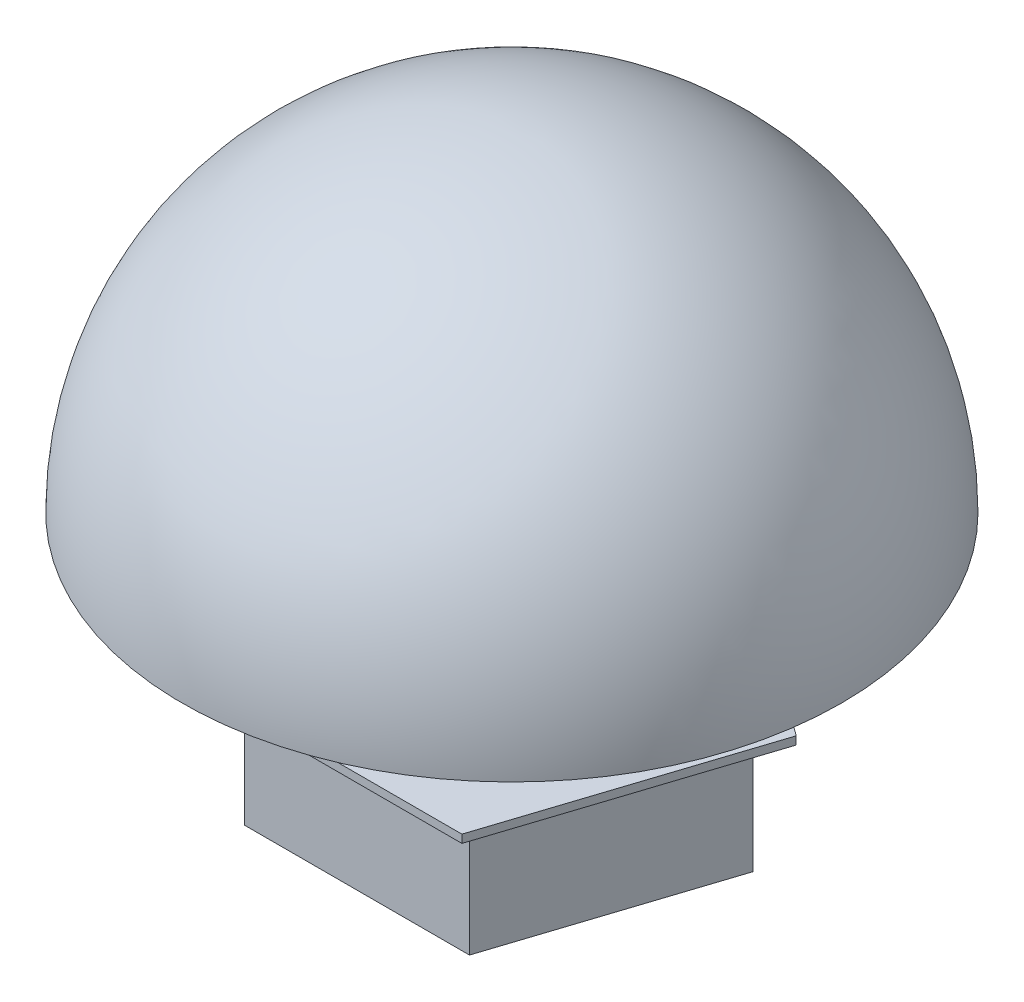
ISO-10303-21;
HEADER;
FILE_DESCRIPTION(('STEP AP214'),'2;1');
FILE_NAME('part.step','',(''),(''),'','','');
FILE_SCHEMA(('AUTOMOTIVE_DESIGN { 1 0 10303 214 1 1 1 1 }'));
ENDSEC;
DATA;
#1=APPLICATION_CONTEXT('core data for automotive mechanical design processes');
#2=APPLICATION_PROTOCOL_DEFINITION('international standard','automotive_design',2000,#1);
#3=PRODUCT_CONTEXT('',#1,'mechanical');
#4=PRODUCT('Part','Part','',(#3));
#5=PRODUCT_RELATED_PRODUCT_CATEGORY('part','',(#4));
#6=PRODUCT_DEFINITION_FORMATION('','',#4);
#7=PRODUCT_DEFINITION_CONTEXT('part definition',#1,'design');
#8=PRODUCT_DEFINITION('design','',#6,#7);
#9=PRODUCT_DEFINITION_SHAPE('','',#8);
#10=(LENGTH_UNIT() NAMED_UNIT(*) SI_UNIT(.MILLI.,.METRE.));
#11=(NAMED_UNIT(*) PLANE_ANGLE_UNIT() SI_UNIT($,.RADIAN.));
#12=(NAMED_UNIT(*) SI_UNIT($,.STERADIAN.) SOLID_ANGLE_UNIT());
#13=UNCERTAINTY_MEASURE_WITH_UNIT(LENGTH_MEASURE(1.E-05),#10,'distance_accuracy_value','');
#14=(GEOMETRIC_REPRESENTATION_CONTEXT(3) GLOBAL_UNCERTAINTY_ASSIGNED_CONTEXT((#13)) GLOBAL_UNIT_ASSIGNED_CONTEXT((#10,
#11,#12)) REPRESENTATION_CONTEXT('',''));
#15=CARTESIAN_POINT('',(0.,0.,0.));
#16=DIRECTION('',(0.,0.,1.));
#17=DIRECTION('',(1.,0.,0.));
#18=AXIS2_PLACEMENT_3D('',#15,#16,#17);
#19=CARTESIAN_POINT('',(0.,31.,0.));
#20=DIRECTION('',(0.,-1.,0.));
#21=DIRECTION('',(1.,0.,0.));
#22=AXIS2_PLACEMENT_3D('',#19,#20,#21);
#23=SPHERICAL_SURFACE('',#22,41.);
#24=CARTESIAN_POINT('',(0.,31.,0.));
#25=DIRECTION('',(0.,-1.,0.));
#26=DIRECTION('',(0.,0.,-1.));
#27=AXIS2_PLACEMENT_3D('',#24,#25,#26);
#28=CIRCLE('',#27,41.);
#29=CARTESIAN_POINT('',(0.,31.,-41.));
#30=VERTEX_POINT('',#29);
#31=EDGE_CURVE('E49',#30,#30,#28,.T.);
#32=ORIENTED_EDGE('',*,*,#31,.F.);
#33=EDGE_LOOP('',(#32));
#34=FACE_BOUND('',#33,.T.);
#35=ADVANCED_FACE('F43',(#34),#23,.T.);
#36=CARTESIAN_POINT('',(0.,31.,0.));
#37=DIRECTION('',(0.,-1.,0.));
#38=DIRECTION('',(-1.,0.,0.));
#39=AXIS2_PLACEMENT_3D('',#36,#37,#38);
#40=SPHERICAL_SURFACE('',#39,40.);
#41=CARTESIAN_POINT('',(0.,31.,0.));
#42=DIRECTION('',(0.,-1.,0.));
#43=DIRECTION('',(0.,0.,-1.));
#44=AXIS2_PLACEMENT_3D('',#41,#42,#43);
#45=CIRCLE('',#44,40.);
#46=CARTESIAN_POINT('',(0.,31.,-40.));
#47=VERTEX_POINT('',#46);
#48=EDGE_CURVE('E11',#47,#47,#45,.T.);
#49=ORIENTED_EDGE('',*,*,#48,.T.);
#50=EDGE_LOOP('',(#49));
#51=FACE_BOUND('',#50,.T.);
#52=ADVANCED_FACE('F58',(#51),#40,.F.);
#53=CARTESIAN_POINT('',(-40.,31.,0.));
#54=DIRECTION('',(0.,1.,0.));
#55=DIRECTION('',(0.,0.,1.));
#56=AXIS2_PLACEMENT_3D('',#53,#54,#55);
#57=PLANE('',#56);
#58=ORIENTED_EDGE('',*,*,#48,.F.);
#59=EDGE_LOOP('',(#58));
#60=FACE_BOUND('',#59,.T.);
#61=ORIENTED_EDGE('',*,*,#31,.T.);
#62=EDGE_LOOP('',(#61));
#63=FACE_BOUND('',#62,.T.);
#64=ADVANCED_FACE('F55',(#60,#63),#57,.F.);
#65=CLOSED_SHELL('',(#35,#52,#64));
#66=MANIFOLD_SOLID_BREP('B2',#65);
#67=CARTESIAN_POINT('',(0.,16.,0.));
#68=DIRECTION('',(0.,1.,0.));
#69=DIRECTION('',(0.,0.,1.));
#70=AXIS2_PLACEMENT_3D('',#67,#68,#69);
#71=PLANE('',#70);
#72=CARTESIAN_POINT('',(0.,16.,0.));
#73=DIRECTION('',(0.,1.,0.));
#74=DIRECTION('',(0.,0.,1.));
#75=AXIS2_PLACEMENT_3D('',#72,#73,#74);
#76=CIRCLE('',#75,2.5);
#77=CARTESIAN_POINT('',(0.,16.,2.5));
#78=VERTEX_POINT('',#77);
#79=EDGE_CURVE('E363',#78,#78,#76,.T.);
#80=ORIENTED_EDGE('',*,*,#79,.F.);
#81=EDGE_LOOP('',(#80));
#82=FACE_BOUND('',#81,.T.);
#83=DIRECTION('',(1.,0.,0.));
#84=VECTOR('',#83,1.);
#85=CARTESIAN_POINT('',(-16.5,16.,22.7103016877744));
#86=LINE('',#85,#84);
#87=CARTESIAN_POINT('',(-16.5,16.,22.7103016877744));
#88=VERTEX_POINT('',#87);
#89=CARTESIAN_POINT('',(16.5,16.,22.7103016877744));
#90=VERTEX_POINT('',#89);
#91=EDGE_CURVE('E370',#88,#90,#86,.T.);
#92=ORIENTED_EDGE('',*,*,#91,.T.);
#93=DIRECTION('',(0.309016994374947,0.,-0.951056516295153));
#94=VECTOR('',#93,1.);
#95=CARTESIAN_POINT('',(16.5,16.,22.7103016877744));
#96=LINE('',#95,#94);
#97=CARTESIAN_POINT('',(26.6975608143733,16.,-8.67456334996571));
#98=VERTEX_POINT('',#97);
#99=EDGE_CURVE('E373',#90,#98,#96,.T.);
#100=ORIENTED_EDGE('',*,*,#99,.T.);
#101=DIRECTION('',(-0.809016994374947,0.,-0.587785252292473));
#102=VECTOR('',#101,1.);
#103=CARTESIAN_POINT('',(26.6975608143733,16.,-8.67456334996571));
#104=LINE('',#103,#102);
#105=CARTESIAN_POINT('',(0.,16.,-28.0714766756173));
#106=VERTEX_POINT('',#105);
#107=EDGE_CURVE('E376',#98,#106,#104,.T.);
#108=ORIENTED_EDGE('',*,*,#107,.T.);
#109=DIRECTION('',(-0.809016994374947,0.,0.587785252292473));
#110=VECTOR('',#109,1.);
#111=CARTESIAN_POINT('',(0.,16.,-28.0714766756173));
#112=LINE('',#111,#110);
#113=CARTESIAN_POINT('',(-26.6975608143733,16.,-8.6745633499657));
#114=VERTEX_POINT('',#113);
#115=EDGE_CURVE('E378',#106,#114,#112,.T.);
#116=ORIENTED_EDGE('',*,*,#115,.T.);
#117=DIRECTION('',(0.309016994374947,0.,0.951056516295153));
#118=VECTOR('',#117,1.);
#119=CARTESIAN_POINT('',(-26.6975608143733,16.,-8.6745633499657));
#120=LINE('',#119,#118);
#121=EDGE_CURVE('E380',#114,#88,#120,.T.);
#122=ORIENTED_EDGE('',*,*,#121,.T.);
#123=EDGE_LOOP('',(#92,#100,#108,#116,#122));
#124=FACE_BOUND('',#123,.T.);
#125=DIRECTION('',(1.,0.,0.));
#126=VECTOR('',#125,1.);
#127=CARTESIAN_POINT('',(-0.499999999999999,16.,-8.));
#128=LINE('',#127,#126);
#129=CARTESIAN_POINT('',(-0.499999999999999,16.,-8.));
#130=VERTEX_POINT('',#129);
#131=CARTESIAN_POINT('',(0.499999999999999,16.,-8.));
#132=VERTEX_POINT('',#131);
#133=EDGE_CURVE('E346',#130,#132,#128,.T.);
#134=ORIENTED_EDGE('',*,*,#133,.F.);
#135=DIRECTION('',(0.,0.,1.));
#136=VECTOR('',#135,1.);
#137=CARTESIAN_POINT('',(-0.5,16.,-19.7162013210007));
#138=LINE('',#137,#136);
#139=CARTESIAN_POINT('',(-0.5,16.,-19.7162013210007));
#140=VERTEX_POINT('',#139);
#141=EDGE_CURVE('E343',#140,#130,#138,.T.);
#142=ORIENTED_EDGE('',*,*,#141,.F.);
#143=DIRECTION('',(-1.,0.,0.));
#144=VECTOR('',#143,1.);
#145=CARTESIAN_POINT('',(-0.5,16.,-19.7162013210007));
#146=LINE('',#145,#144);
#147=CARTESIAN_POINT('',(0.5,16.,-19.7162013210007));
#148=VERTEX_POINT('',#147);
#149=EDGE_CURVE('E351',#148,#140,#146,.T.);
#150=ORIENTED_EDGE('',*,*,#149,.F.);
#151=DIRECTION('',(0.,0.,-1.));
#152=VECTOR('',#151,1.);
#153=CARTESIAN_POINT('',(0.5,16.,-19.7162013210007));
#154=LINE('',#153,#152);
#155=EDGE_CURVE('E348',#132,#148,#154,.T.);
#156=ORIENTED_EDGE('',*,*,#155,.F.);
#157=EDGE_LOOP('',(#134,#142,#150,#156));
#158=FACE_BOUND('',#157,.T.);
#159=DIRECTION('',(-0.866025403784439,0.,-0.5));
#160=VECTOR('',#159,1.);
#161=CARTESIAN_POINT('',(17.3247312101156,16.,9.4250879586077));
#162=LINE('',#161,#160);
#163=CARTESIAN_POINT('',(17.3247312101156,16.,9.4250879586077));
#164=VERTEX_POINT('',#163);
#165=CARTESIAN_POINT('',(7.17820323027617,16.,3.56698729810734));
#166=VERTEX_POINT('',#165);
#167=EDGE_CURVE('E328',#164,#166,#162,.T.);
#168=ORIENTED_EDGE('',*,*,#167,.F.);
#169=DIRECTION('',(0.5,0.,-0.866025403784439));
#170=VECTOR('',#169,1.);
#171=CARTESIAN_POINT('',(17.3247312101156,16.,9.4250879586077));
#172=LINE('',#171,#170);
#173=CARTESIAN_POINT('',(16.8247312101156,16.,10.2911133623921));
#174=VERTEX_POINT('',#173);
#175=EDGE_CURVE('E273',#174,#164,#172,.T.);
#176=ORIENTED_EDGE('',*,*,#175,.F.);
#177=DIRECTION('',(0.866025403784439,0.,0.5));
#178=VECTOR('',#177,1.);
#179=CARTESIAN_POINT('',(16.8247312101156,16.,10.2911133623921));
#180=LINE('',#179,#178);
#181=CARTESIAN_POINT('',(6.67820323027617,16.,4.43301270189178));
#182=VERTEX_POINT('',#181);
#183=EDGE_CURVE('E332',#182,#174,#180,.T.);
#184=ORIENTED_EDGE('',*,*,#183,.F.);
#185=DIRECTION('',(-0.5,0.,0.866025403784438));
#186=VECTOR('',#185,1.);
#187=CARTESIAN_POINT('',(7.17820323027617,16.,3.56698729810734));
#188=LINE('',#187,#186);
#189=EDGE_CURVE('E330',#166,#182,#188,.T.);
#190=ORIENTED_EDGE('',*,*,#189,.F.);
#191=EDGE_LOOP('',(#168,#176,#184,#190));
#192=FACE_BOUND('',#191,.T.);
#193=DIRECTION('',(0.866025403784438,0.,-0.5));
#194=VECTOR('',#193,1.);
#195=CARTESIAN_POINT('',(-16.8247312101142,16.,10.2911133623929));
#196=LINE('',#195,#194);
#197=CARTESIAN_POINT('',(-16.8247312101142,16.,10.2911133623929));
#198=VERTEX_POINT('',#197);
#199=CARTESIAN_POINT('',(-6.6782032302748,16.,4.43301270189257));
#200=VERTEX_POINT('',#199);
#201=EDGE_CURVE('E316',#198,#200,#196,.T.);
#202=ORIENTED_EDGE('',*,*,#201,.F.);
#203=DIRECTION('',(0.5,0.,0.866025403784439));
#204=VECTOR('',#203,1.);
#205=CARTESIAN_POINT('',(-16.8247312101142,16.,10.2911133623929));
#206=LINE('',#205,#204);
#207=CARTESIAN_POINT('',(-17.3247312101142,16.,9.4250879586085));
#208=VERTEX_POINT('',#207);
#209=EDGE_CURVE('E270',#208,#198,#206,.T.);
#210=ORIENTED_EDGE('',*,*,#209,.F.);
#211=DIRECTION('',(-0.866025403784438,0.,0.5));
#212=VECTOR('',#211,1.);
#213=CARTESIAN_POINT('',(-17.3247312101142,16.,9.4250879586085));
#214=LINE('',#213,#212);
#215=CARTESIAN_POINT('',(-7.1782032302748,16.,3.56698729810814));
#216=VERTEX_POINT('',#215);
#217=EDGE_CURVE('E320',#216,#208,#214,.T.);
#218=ORIENTED_EDGE('',*,*,#217,.F.);
#219=DIRECTION('',(-0.500000000000001,0.,-0.866025403784438));
#220=VECTOR('',#219,1.);
#221=CARTESIAN_POINT('',(-6.6782032302748,16.,4.43301270189257));
#222=LINE('',#221,#220);
#223=EDGE_CURVE('E318',#200,#216,#222,.T.);
#224=ORIENTED_EDGE('',*,*,#223,.F.);
#225=EDGE_LOOP('',(#202,#210,#218,#224));
#226=FACE_BOUND('',#225,.T.);
#227=ADVANCED_FACE('F84',(#82,#124,#158,#192,#226),#71,.T.);
#228=CARTESIAN_POINT('',(0.,0.,0.));
#229=DIRECTION('',(0.,1.,0.));
#230=DIRECTION('',(0.,0.,1.));
#231=AXIS2_PLACEMENT_3D('',#228,#229,#230);
#232=PLANE('',#231);
#233=DIRECTION('',(-0.809016994374947,0.,0.587785252292473));
#234=VECTOR('',#233,1.);
#235=CARTESIAN_POINT('',(0.,0.,-23.8182226338571));
#236=LINE('',#235,#234);
#237=CARTESIAN_POINT('',(0.,0.,-23.8182226338571));
#238=VERTEX_POINT('',#237);
#239=CARTESIAN_POINT('',(-22.6524758424985,0.,-7.36023556966787));
#240=VERTEX_POINT('',#239);
#241=EDGE_CURVE('E448',#238,#240,#236,.T.);
#242=ORIENTED_EDGE('',*,*,#241,.F.);
#243=DIRECTION('',(-0.809016994374948,0.,-0.587785252292473));
#244=VECTOR('',#243,1.);
#245=CARTESIAN_POINT('',(22.6524758424985,0.,-7.36023556966788));
#246=LINE('',#245,#244);
#247=CARTESIAN_POINT('',(22.6524758424985,0.,-7.36023556966788));
#248=VERTEX_POINT('',#247);
#249=EDGE_CURVE('E453',#248,#238,#246,.T.);
#250=ORIENTED_EDGE('',*,*,#249,.F.);
#251=DIRECTION('',(0.309016994374947,0.,-0.951056516295154));
#252=VECTOR('',#251,1.);
#253=CARTESIAN_POINT('',(14.,0.,19.2693468865964));
#254=LINE('',#253,#252);
#255=CARTESIAN_POINT('',(14.,0.,19.2693468865964));
#256=VERTEX_POINT('',#255);
#257=EDGE_CURVE('E472',#256,#248,#254,.T.);
#258=ORIENTED_EDGE('',*,*,#257,.F.);
#259=DIRECTION('',(1.,0.,0.));
#260=VECTOR('',#259,1.);
#261=CARTESIAN_POINT('',(-14.,0.,19.2693468865964));
#262=LINE('',#261,#260);
#263=CARTESIAN_POINT('',(-14.,0.,19.2693468865964));
#264=VERTEX_POINT('',#263);
#265=EDGE_CURVE('E470',#264,#256,#262,.T.);
#266=ORIENTED_EDGE('',*,*,#265,.F.);
#267=DIRECTION('',(0.309016994374947,0.,0.951056516295154));
#268=VECTOR('',#267,1.);
#269=CARTESIAN_POINT('',(-22.6524758424985,0.,-7.36023556966787));
#270=LINE('',#269,#268);
#271=EDGE_CURVE('E468',#240,#264,#270,.T.);
#272=ORIENTED_EDGE('',*,*,#271,.F.);
#273=EDGE_LOOP('',(#242,#250,#258,#266,#272));
#274=FACE_BOUND('',#273,.T.);
#275=DIRECTION('',(1.,0.,0.));
#276=VECTOR('',#275,1.);
#277=CARTESIAN_POINT('',(-13.2734574719946,0.,18.2693468865964));
#278=LINE('',#277,#276);
#279=CARTESIAN_POINT('',(-13.2734574719946,0.,18.2693468865964));
#280=VERTEX_POINT('',#279);
#281=CARTESIAN_POINT('',(13.2734574719946,0.,18.2693468865964));
#282=VERTEX_POINT('',#281);
#283=EDGE_CURVE('E406',#280,#282,#278,.T.);
#284=ORIENTED_EDGE('',*,*,#283,.T.);
#285=DIRECTION('',(0.309016994374948,0.,-0.951056516295154));
#286=VECTOR('',#285,1.);
#287=CARTESIAN_POINT('',(13.2734574719946,0.,18.2693468865964));
#288=LINE('',#287,#286);
#289=CARTESIAN_POINT('',(21.4769053379136,0.,-6.97826955841777));
#290=VERTEX_POINT('',#289);
#291=EDGE_CURVE('E426',#282,#290,#288,.T.);
#292=ORIENTED_EDGE('',*,*,#291,.T.);
#293=DIRECTION('',(-0.809016994374947,0.,-0.587785252292473));
#294=VECTOR('',#293,1.);
#295=CARTESIAN_POINT('',(21.4769053379136,0.,-6.97826955841777));
#296=LINE('',#295,#294);
#297=CARTESIAN_POINT('',(0.,0.,-22.5821546563573));
#298=VERTEX_POINT('',#297);
#299=EDGE_CURVE('E429',#290,#298,#296,.T.);
#300=ORIENTED_EDGE('',*,*,#299,.T.);
#301=DIRECTION('',(-0.809016994374947,0.,0.587785252292473));
#302=VECTOR('',#301,1.);
#303=CARTESIAN_POINT('',(0.,0.,-22.5821546563573));
#304=LINE('',#303,#302);
#305=CARTESIAN_POINT('',(-21.4769053379136,0.,-6.97826955841777));
#306=VERTEX_POINT('',#305);
#307=EDGE_CURVE('E432',#298,#306,#304,.T.);
#308=ORIENTED_EDGE('',*,*,#307,.T.);
#309=DIRECTION('',(0.309016994374948,0.,0.951056516295154));
#310=VECTOR('',#309,1.);
#311=CARTESIAN_POINT('',(-21.4769053379136,0.,-6.97826955841777));
#312=LINE('',#311,#310);
#313=EDGE_CURVE('E411',#306,#280,#312,.T.);
#314=ORIENTED_EDGE('',*,*,#313,.T.);
#315=EDGE_LOOP('',(#284,#292,#300,#308,#314));
#316=FACE_BOUND('',#315,.T.);
#317=ADVANCED_FACE('F491',(#274,#316),#232,.F.);
#318=CARTESIAN_POINT('',(0.,15.,-23.8182226338571));
#319=DIRECTION('',(0.587785252292473,0.,0.809016994374947));
#320=DIRECTION('',(0.809016994374948,0.,-0.587785252292473));
#321=AXIS2_PLACEMENT_3D('',#318,#319,#320);
#322=PLANE('',#321);
#323=ORIENTED_EDGE('',*,*,#241,.T.);
#324=DIRECTION('',(0.,-1.,0.));
#325=VECTOR('',#324,1.);
#326=CARTESIAN_POINT('',(-22.6524758424985,15.,-7.36023556966787));
#327=LINE('',#326,#325);
#328=CARTESIAN_POINT('',(-22.6524758424985,15.,-7.36023556966787));
#329=VERTEX_POINT('',#328);
#330=EDGE_CURVE('E41',#329,#240,#327,.T.);
#331=ORIENTED_EDGE('',*,*,#330,.F.);
#332=DIRECTION('',(-0.809016994374947,0.,0.587785252292473));
#333=VECTOR('',#332,1.);
#334=CARTESIAN_POINT('',(0.,15.,-23.8182226338571));
#335=LINE('',#334,#333);
#336=CARTESIAN_POINT('',(0.,15.,-23.8182226338571));
#337=VERTEX_POINT('',#336);
#338=EDGE_CURVE('E449',#337,#329,#335,.T.);
#339=ORIENTED_EDGE('',*,*,#338,.F.);
#340=DIRECTION('',(0.,-1.,0.));
#341=VECTOR('',#340,1.);
#342=CARTESIAN_POINT('',(0.,15.,-23.8182226338571));
#343=LINE('',#342,#341);
#344=EDGE_CURVE('E465',#337,#238,#343,.T.);
#345=ORIENTED_EDGE('',*,*,#344,.T.);
#346=EDGE_LOOP('',(#323,#331,#339,#345));
#347=FACE_BOUND('',#346,.T.);
#348=ADVANCED_FACE('F86',(#347),#322,.F.);
#349=CARTESIAN_POINT('',(-22.6524758424985,15.,-7.36023556966787));
#350=DIRECTION('',(0.951056516295154,0.,-0.309016994374947));
#351=DIRECTION('',(-0.309016994374947,0.,-0.951056516295154));
#352=AXIS2_PLACEMENT_3D('',#349,#350,#351);
#353=PLANE('',#352);
#354=ORIENTED_EDGE('',*,*,#271,.T.);
#355=DIRECTION('',(0.,-1.,0.));
#356=VECTOR('',#355,1.);
#357=CARTESIAN_POINT('',(-14.,15.,19.2693468865964));
#358=LINE('',#357,#356);
#359=CARTESIAN_POINT('',(-14.,15.,19.2693468865964));
#360=VERTEX_POINT('',#359);
#361=EDGE_CURVE('E92',#360,#264,#358,.T.);
#362=ORIENTED_EDGE('',*,*,#361,.F.);
#363=DIRECTION('',(0.309016994374947,0.,0.951056516295154));
#364=VECTOR('',#363,1.);
#365=CARTESIAN_POINT('',(-22.6524758424985,15.,-7.36023556966787));
#366=LINE('',#365,#364);
#367=EDGE_CURVE('E452',#329,#360,#366,.T.);
#368=ORIENTED_EDGE('',*,*,#367,.F.);
#369=ORIENTED_EDGE('',*,*,#330,.T.);
#370=EDGE_LOOP('',(#354,#362,#368,#369));
#371=FACE_BOUND('',#370,.T.);
#372=ADVANCED_FACE('F504',(#371),#353,.F.);
#373=CARTESIAN_POINT('',(-14.,15.,19.2693468865964));
#374=DIRECTION('',(0.,0.,-1.));
#375=DIRECTION('',(-1.,0.,0.));
#376=AXIS2_PLACEMENT_3D('',#373,#374,#375);
#377=PLANE('',#376);
#378=ORIENTED_EDGE('',*,*,#265,.T.);
#379=DIRECTION('',(0.,-1.,0.));
#380=VECTOR('',#379,1.);
#381=CARTESIAN_POINT('',(14.,15.,19.2693468865964));
#382=LINE('',#381,#380);
#383=CARTESIAN_POINT('',(14.,15.,19.2693468865964));
#384=VERTEX_POINT('',#383);
#385=EDGE_CURVE('E480',#384,#256,#382,.T.);
#386=ORIENTED_EDGE('',*,*,#385,.F.);
#387=DIRECTION('',(1.,0.,0.));
#388=VECTOR('',#387,1.);
#389=CARTESIAN_POINT('',(-14.,15.,19.2693468865964));
#390=LINE('',#389,#388);
#391=EDGE_CURVE('E456',#360,#384,#390,.T.);
#392=ORIENTED_EDGE('',*,*,#391,.F.);
#393=ORIENTED_EDGE('',*,*,#361,.T.);
#394=EDGE_LOOP('',(#378,#386,#392,#393));
#395=FACE_BOUND('',#394,.T.);
#396=ADVANCED_FACE('F486',(#395),#377,.F.);
#397=CARTESIAN_POINT('',(14.,15.,19.2693468865964));
#398=DIRECTION('',(-0.951056516295154,0.,-0.309016994374947));
#399=DIRECTION('',(-0.309016994374947,0.,0.951056516295154));
#400=AXIS2_PLACEMENT_3D('',#397,#398,#399);
#401=PLANE('',#400);
#402=ORIENTED_EDGE('',*,*,#257,.T.);
#403=DIRECTION('',(0.,-1.,0.));
#404=VECTOR('',#403,1.);
#405=CARTESIAN_POINT('',(22.6524758424985,15.,-7.36023556966788));
#406=LINE('',#405,#404);
#407=CARTESIAN_POINT('',(22.6524758424985,15.,-7.36023556966788));
#408=VERTEX_POINT('',#407);
#409=EDGE_CURVE('E477',#408,#248,#406,.T.);
#410=ORIENTED_EDGE('',*,*,#409,.F.);
#411=DIRECTION('',(0.309016994374947,0.,-0.951056516295154));
#412=VECTOR('',#411,1.);
#413=CARTESIAN_POINT('',(14.,15.,19.2693468865964));
#414=LINE('',#413,#412);
#415=EDGE_CURVE('E459',#384,#408,#414,.T.);
#416=ORIENTED_EDGE('',*,*,#415,.F.);
#417=ORIENTED_EDGE('',*,*,#385,.T.);
#418=EDGE_LOOP('',(#402,#410,#416,#417));
#419=FACE_BOUND('',#418,.T.);
#420=ADVANCED_FACE('F495',(#419),#401,.F.);
#421=CARTESIAN_POINT('',(22.6524758424985,15.,-7.36023556966788));
#422=DIRECTION('',(-0.587785252292473,0.,0.809016994374948));
#423=DIRECTION('',(0.809016994374948,0.,0.587785252292473));
#424=AXIS2_PLACEMENT_3D('',#421,#422,#423);
#425=PLANE('',#424);
#426=ORIENTED_EDGE('',*,*,#249,.T.);
#427=ORIENTED_EDGE('',*,*,#344,.F.);
#428=DIRECTION('',(-0.809016994374948,0.,-0.587785252292473));
#429=VECTOR('',#428,1.);
#430=CARTESIAN_POINT('',(22.6524758424985,15.,-7.36023556966788));
#431=LINE('',#430,#429);
#432=EDGE_CURVE('E462',#408,#337,#431,.T.);
#433=ORIENTED_EDGE('',*,*,#432,.F.);
#434=ORIENTED_EDGE('',*,*,#409,.T.);
#435=EDGE_LOOP('',(#426,#427,#433,#434));
#436=FACE_BOUND('',#435,.T.);
#437=ADVANCED_FACE('F499',(#436),#425,.F.);
#438=CARTESIAN_POINT('',(-13.2734574719946,15.,18.2693468865964));
#439=DIRECTION('',(0.,0.,-1.));
#440=DIRECTION('',(-1.,0.,0.));
#441=AXIS2_PLACEMENT_3D('',#438,#439,#440);
#442=PLANE('',#441);
#443=ORIENTED_EDGE('',*,*,#283,.F.);
#444=DIRECTION('',(0.,-1.,0.));
#445=VECTOR('',#444,1.);
#446=CARTESIAN_POINT('',(-13.2734574719946,15.,18.2693468865964));
#447=LINE('',#446,#445);
#448=CARTESIAN_POINT('',(-13.2734574719946,15.,18.2693468865964));
#449=VERTEX_POINT('',#448);
#450=EDGE_CURVE('E423',#449,#280,#447,.T.);
#451=ORIENTED_EDGE('',*,*,#450,.F.);
#452=DIRECTION('',(1.,0.,0.));
#453=VECTOR('',#452,1.);
#454=CARTESIAN_POINT('',(-13.2734574719946,15.,18.2693468865964));
#455=LINE('',#454,#453);
#456=CARTESIAN_POINT('',(13.2734574719946,15.,18.2693468865964));
#457=VERTEX_POINT('',#456);
#458=EDGE_CURVE('E407',#449,#457,#455,.T.);
#459=ORIENTED_EDGE('',*,*,#458,.T.);
#460=DIRECTION('',(0.,-1.,0.));
#461=VECTOR('',#460,1.);
#462=CARTESIAN_POINT('',(13.2734574719946,15.,18.2693468865964));
#463=LINE('',#462,#461);
#464=EDGE_CURVE('E445',#457,#282,#463,.T.);
#465=ORIENTED_EDGE('',*,*,#464,.T.);
#466=EDGE_LOOP('',(#443,#451,#459,#465));
#467=FACE_BOUND('',#466,.T.);
#468=ADVANCED_FACE('F562',(#467),#442,.T.);
#469=CARTESIAN_POINT('',(13.2734574719946,15.,18.2693468865964));
#470=DIRECTION('',(-0.951056516295154,0.,-0.309016994374948));
#471=DIRECTION('',(-0.309016994374948,0.,0.951056516295154));
#472=AXIS2_PLACEMENT_3D('',#469,#470,#471);
#473=PLANE('',#472);
#474=ORIENTED_EDGE('',*,*,#291,.F.);
#475=ORIENTED_EDGE('',*,*,#464,.F.);
#476=DIRECTION('',(0.309016994374948,0.,-0.951056516295154));
#477=VECTOR('',#476,1.);
#478=CARTESIAN_POINT('',(13.2734574719946,15.,18.2693468865964));
#479=LINE('',#478,#477);
#480=CARTESIAN_POINT('',(21.4769053379136,15.,-6.97826955841777));
#481=VERTEX_POINT('',#480);
#482=EDGE_CURVE('E410',#457,#481,#479,.T.);
#483=ORIENTED_EDGE('',*,*,#482,.T.);
#484=DIRECTION('',(0.,-1.,0.));
#485=VECTOR('',#484,1.);
#486=CARTESIAN_POINT('',(21.4769053379136,15.,-6.97826955841777));
#487=LINE('',#486,#485);
#488=EDGE_CURVE('E443',#481,#290,#487,.T.);
#489=ORIENTED_EDGE('',*,*,#488,.T.);
#490=EDGE_LOOP('',(#474,#475,#483,#489));
#491=FACE_BOUND('',#490,.T.);
#492=ADVANCED_FACE('F558',(#491),#473,.T.);
#493=CARTESIAN_POINT('',(21.4769053379136,15.,-6.97826955841777));
#494=DIRECTION('',(-0.587785252292473,0.,0.809016994374947));
#495=DIRECTION('',(0.809016994374948,0.,0.587785252292473));
#496=AXIS2_PLACEMENT_3D('',#493,#494,#495);
#497=PLANE('',#496);
#498=ORIENTED_EDGE('',*,*,#299,.F.);
#499=ORIENTED_EDGE('',*,*,#488,.F.);
#500=DIRECTION('',(-0.809016994374947,0.,-0.587785252292473));
#501=VECTOR('',#500,1.);
#502=CARTESIAN_POINT('',(21.4769053379136,15.,-6.97826955841777));
#503=LINE('',#502,#501);
#504=CARTESIAN_POINT('',(0.,15.,-22.5821546563573));
#505=VERTEX_POINT('',#504);
#506=EDGE_CURVE('E414',#481,#505,#503,.T.);
#507=ORIENTED_EDGE('',*,*,#506,.T.);
#508=DIRECTION('',(0.,-1.,0.));
#509=VECTOR('',#508,1.);
#510=CARTESIAN_POINT('',(0.,15.,-22.5821546563573));
#511=LINE('',#510,#509);
#512=EDGE_CURVE('E441',#505,#298,#511,.T.);
#513=ORIENTED_EDGE('',*,*,#512,.T.);
#514=EDGE_LOOP('',(#498,#499,#507,#513));
#515=FACE_BOUND('',#514,.T.);
#516=ADVANCED_FACE('F554',(#515),#497,.T.);
#517=CARTESIAN_POINT('',(0.,15.,-22.5821546563573));
#518=DIRECTION('',(0.587785252292473,0.,0.809016994374947));
#519=DIRECTION('',(0.809016994374948,0.,-0.587785252292473));
#520=AXIS2_PLACEMENT_3D('',#517,#518,#519);
#521=PLANE('',#520);
#522=ORIENTED_EDGE('',*,*,#307,.F.);
#523=ORIENTED_EDGE('',*,*,#512,.F.);
#524=DIRECTION('',(-0.809016994374947,0.,0.587785252292473));
#525=VECTOR('',#524,1.);
#526=CARTESIAN_POINT('',(0.,15.,-22.5821546563573));
#527=LINE('',#526,#525);
#528=CARTESIAN_POINT('',(-21.4769053379136,15.,-6.97826955841777));
#529=VERTEX_POINT('',#528);
#530=EDGE_CURVE('E417',#505,#529,#527,.T.);
#531=ORIENTED_EDGE('',*,*,#530,.T.);
#532=DIRECTION('',(0.,-1.,0.));
#533=VECTOR('',#532,1.);
#534=CARTESIAN_POINT('',(-21.4769053379136,15.,-6.97826955841777));
#535=LINE('',#534,#533);
#536=EDGE_CURVE('E439',#529,#306,#535,.T.);
#537=ORIENTED_EDGE('',*,*,#536,.T.);
#538=EDGE_LOOP('',(#522,#523,#531,#537));
#539=FACE_BOUND('',#538,.T.);
#540=ADVANCED_FACE('F550',(#539),#521,.T.);
#541=CARTESIAN_POINT('',(-21.4769053379136,15.,-6.97826955841777));
#542=DIRECTION('',(0.951056516295154,0.,-0.309016994374948));
#543=DIRECTION('',(-0.309016994374948,0.,-0.951056516295154));
#544=AXIS2_PLACEMENT_3D('',#541,#542,#543);
#545=PLANE('',#544);
#546=ORIENTED_EDGE('',*,*,#313,.F.);
#547=ORIENTED_EDGE('',*,*,#536,.F.);
#548=DIRECTION('',(0.309016994374948,0.,0.951056516295154));
#549=VECTOR('',#548,1.);
#550=CARTESIAN_POINT('',(-21.4769053379136,15.,-6.97826955841777));
#551=LINE('',#550,#549);
#552=EDGE_CURVE('E420',#529,#449,#551,.T.);
#553=ORIENTED_EDGE('',*,*,#552,.T.);
#554=ORIENTED_EDGE('',*,*,#450,.T.);
#555=EDGE_LOOP('',(#546,#547,#553,#554));
#556=FACE_BOUND('',#555,.T.);
#557=ADVANCED_FACE('F526',(#556),#545,.T.);
#558=CARTESIAN_POINT('',(0.,15.,0.));
#559=DIRECTION('',(0.,1.,0.));
#560=DIRECTION('',(0.,0.,1.));
#561=AXIS2_PLACEMENT_3D('',#558,#559,#560);
#562=PLANE('',#561);
#563=CARTESIAN_POINT('',(0.,15.,0.));
#564=DIRECTION('',(0.,1.,0.));
#565=DIRECTION('',(0.,0.,1.));
#566=AXIS2_PLACEMENT_3D('',#563,#564,#565);
#567=CIRCLE('',#566,2.5);
#568=CARTESIAN_POINT('',(0.,15.,2.5));
#569=VERTEX_POINT('',#568);
#570=EDGE_CURVE('E366',#569,#569,#567,.T.);
#571=ORIENTED_EDGE('',*,*,#570,.T.);
#572=EDGE_LOOP('',(#571));
#573=FACE_BOUND('',#572,.T.);
#574=ORIENTED_EDGE('',*,*,#482,.F.);
#575=ORIENTED_EDGE('',*,*,#458,.F.);
#576=ORIENTED_EDGE('',*,*,#552,.F.);
#577=ORIENTED_EDGE('',*,*,#530,.F.);
#578=ORIENTED_EDGE('',*,*,#506,.F.);
#579=EDGE_LOOP('',(#574,#575,#576,#577,#578));
#580=FACE_BOUND('',#579,.T.);
#581=ADVANCED_FACE('F523',(#573,#580),#562,.F.);
#582=DIRECTION('',(1.,0.,0.));
#583=VECTOR('',#582,1.);
#584=CARTESIAN_POINT('',(-16.5,15.,22.7103016877744));
#585=LINE('',#584,#583);
#586=CARTESIAN_POINT('',(-16.5,15.,22.7103016877744));
#587=VERTEX_POINT('',#586);
#588=CARTESIAN_POINT('',(16.5,15.,22.7103016877744));
#589=VERTEX_POINT('',#588);
#590=EDGE_CURVE('E369',#587,#589,#585,.T.);
#591=ORIENTED_EDGE('',*,*,#590,.F.);
#592=DIRECTION('',(0.309016994374947,0.,0.951056516295153));
#593=VECTOR('',#592,1.);
#594=CARTESIAN_POINT('',(-26.6975608143733,15.,-8.6745633499657));
#595=LINE('',#594,#593);
#596=CARTESIAN_POINT('',(-26.6975608143733,15.,-8.6745633499657));
#597=VERTEX_POINT('',#596);
#598=EDGE_CURVE('E374',#597,#587,#595,.T.);
#599=ORIENTED_EDGE('',*,*,#598,.F.);
#600=DIRECTION('',(-0.809016994374947,0.,0.587785252292473));
#601=VECTOR('',#600,1.);
#602=CARTESIAN_POINT('',(0.,15.,-28.0714766756173));
#603=LINE('',#602,#601);
#604=CARTESIAN_POINT('',(0.,15.,-28.0714766756173));
#605=VERTEX_POINT('',#604);
#606=EDGE_CURVE('E389',#605,#597,#603,.T.);
#607=ORIENTED_EDGE('',*,*,#606,.F.);
#608=DIRECTION('',(-0.809016994374947,0.,-0.587785252292473));
#609=VECTOR('',#608,1.);
#610=CARTESIAN_POINT('',(26.6975608143733,15.,-8.67456334996571));
#611=LINE('',#610,#609);
#612=CARTESIAN_POINT('',(26.6975608143733,15.,-8.67456334996571));
#613=VERTEX_POINT('',#612);
#614=EDGE_CURVE('E387',#613,#605,#611,.T.);
#615=ORIENTED_EDGE('',*,*,#614,.F.);
#616=DIRECTION('',(0.309016994374947,0.,-0.951056516295153));
#617=VECTOR('',#616,1.);
#618=CARTESIAN_POINT('',(16.5,15.,22.7103016877744));
#619=LINE('',#618,#617);
#620=EDGE_CURVE('E385',#589,#613,#619,.T.);
#621=ORIENTED_EDGE('',*,*,#620,.F.);
#622=EDGE_LOOP('',(#591,#599,#607,#615,#621));
#623=FACE_BOUND('',#622,.T.);
#624=ORIENTED_EDGE('',*,*,#432,.T.);
#625=ORIENTED_EDGE('',*,*,#338,.T.);
#626=ORIENTED_EDGE('',*,*,#367,.T.);
#627=ORIENTED_EDGE('',*,*,#391,.T.);
#628=ORIENTED_EDGE('',*,*,#415,.T.);
#629=EDGE_LOOP('',(#624,#625,#626,#627,#628));
#630=FACE_BOUND('',#629,.T.);
#631=ADVANCED_FACE('F502',(#623,#630),#562,.F.);
#632=CARTESIAN_POINT('',(-16.5,16.,22.7103016877744));
#633=DIRECTION('',(0.,0.,-1.));
#634=DIRECTION('',(-1.,0.,0.));
#635=AXIS2_PLACEMENT_3D('',#632,#633,#634);
#636=PLANE('',#635);
#637=ORIENTED_EDGE('',*,*,#590,.T.);
#638=DIRECTION('',(0.,-1.,0.));
#639=VECTOR('',#638,1.);
#640=CARTESIAN_POINT('',(16.5,16.,22.7103016877744));
#641=LINE('',#640,#639);
#642=EDGE_CURVE('E403',#90,#589,#641,.T.);
#643=ORIENTED_EDGE('',*,*,#642,.F.);
#644=ORIENTED_EDGE('',*,*,#91,.F.);
#645=DIRECTION('',(0.,-1.,0.));
#646=VECTOR('',#645,1.);
#647=CARTESIAN_POINT('',(-16.5,16.,22.7103016877744));
#648=LINE('',#647,#646);
#649=EDGE_CURVE('E382',#88,#587,#648,.T.);
#650=ORIENTED_EDGE('',*,*,#649,.T.);
#651=EDGE_LOOP('',(#637,#643,#644,#650));
#652=FACE_BOUND('',#651,.T.);
#653=ADVANCED_FACE('F543',(#652),#636,.F.);
#654=CARTESIAN_POINT('',(16.5,16.,22.7103016877744));
#655=DIRECTION('',(-0.951056516295154,0.,-0.309016994374947));
#656=DIRECTION('',(-0.309016994374948,0.,0.951056516295154));
#657=AXIS2_PLACEMENT_3D('',#654,#655,#656);
#658=PLANE('',#657);
#659=ORIENTED_EDGE('',*,*,#620,.T.);
#660=DIRECTION('',(0.,-1.,0.));
#661=VECTOR('',#660,1.);
#662=CARTESIAN_POINT('',(26.6975608143733,16.,-8.67456334996571));
#663=LINE('',#662,#661);
#664=EDGE_CURVE('E400',#98,#613,#663,.T.);
#665=ORIENTED_EDGE('',*,*,#664,.F.);
#666=ORIENTED_EDGE('',*,*,#99,.F.);
#667=ORIENTED_EDGE('',*,*,#642,.T.);
#668=EDGE_LOOP('',(#659,#665,#666,#667));
#669=FACE_BOUND('',#668,.T.);
#670=ADVANCED_FACE('F539',(#669),#658,.F.);
#671=CARTESIAN_POINT('',(26.6975608143733,16.,-8.67456334996571));
#672=DIRECTION('',(-0.587785252292473,0.,0.809016994374948));
#673=DIRECTION('',(0.809016994374947,0.,0.587785252292473));
#674=AXIS2_PLACEMENT_3D('',#671,#672,#673);
#675=PLANE('',#674);
#676=ORIENTED_EDGE('',*,*,#614,.T.);
#677=DIRECTION('',(0.,-1.,0.));
#678=VECTOR('',#677,1.);
#679=CARTESIAN_POINT('',(0.,16.,-28.0714766756173));
#680=LINE('',#679,#678);
#681=EDGE_CURVE('E397',#106,#605,#680,.T.);
#682=ORIENTED_EDGE('',*,*,#681,.F.);
#683=ORIENTED_EDGE('',*,*,#107,.F.);
#684=ORIENTED_EDGE('',*,*,#664,.T.);
#685=EDGE_LOOP('',(#676,#682,#683,#684));
#686=FACE_BOUND('',#685,.T.);
#687=ADVANCED_FACE('F535',(#686),#675,.F.);
#688=CARTESIAN_POINT('',(0.,16.,-28.0714766756173));
#689=DIRECTION('',(0.587785252292473,0.,0.809016994374947));
#690=DIRECTION('',(0.809016994374948,0.,-0.587785252292473));
#691=AXIS2_PLACEMENT_3D('',#688,#689,#690);
#692=PLANE('',#691);
#693=ORIENTED_EDGE('',*,*,#606,.T.);
#694=DIRECTION('',(0.,-1.,0.));
#695=VECTOR('',#694,1.);
#696=CARTESIAN_POINT('',(-26.6975608143733,16.,-8.6745633499657));
#697=LINE('',#696,#695);
#698=EDGE_CURVE('E394',#114,#597,#697,.T.);
#699=ORIENTED_EDGE('',*,*,#698,.F.);
#700=ORIENTED_EDGE('',*,*,#115,.F.);
#701=ORIENTED_EDGE('',*,*,#681,.T.);
#702=EDGE_LOOP('',(#693,#699,#700,#701));
#703=FACE_BOUND('',#702,.T.);
#704=ADVANCED_FACE('F531',(#703),#692,.F.);
#705=CARTESIAN_POINT('',(-26.6975608143733,16.,-8.6745633499657));
#706=DIRECTION('',(0.951056516295154,0.,-0.309016994374947));
#707=DIRECTION('',(-0.309016994374948,0.,-0.951056516295154));
#708=AXIS2_PLACEMENT_3D('',#705,#706,#707);
#709=PLANE('',#708);
#710=ORIENTED_EDGE('',*,*,#598,.T.);
#711=ORIENTED_EDGE('',*,*,#649,.F.);
#712=ORIENTED_EDGE('',*,*,#121,.F.);
#713=ORIENTED_EDGE('',*,*,#698,.T.);
#714=EDGE_LOOP('',(#710,#711,#712,#713));
#715=FACE_BOUND('',#714,.T.);
#716=ADVANCED_FACE('F528',(#715),#709,.F.);
#717=CARTESIAN_POINT('',(0.,14.,0.));
#718=DIRECTION('',(0.,1.,0.));
#719=DIRECTION('',(0.,0.,1.));
#720=AXIS2_PLACEMENT_3D('',#717,#718,#719);
#721=CYLINDRICAL_SURFACE('',#720,2.5);
#722=ORIENTED_EDGE('',*,*,#79,.T.);
#723=EDGE_LOOP('',(#722));
#724=FACE_BOUND('',#723,.T.);
#725=ORIENTED_EDGE('',*,*,#570,.F.);
#726=EDGE_LOOP('',(#725));
#727=FACE_BOUND('',#726,.T.);
#728=ADVANCED_FACE('F521',(#724,#727),#721,.F.);
#729=CARTESIAN_POINT('',(-0.5,31.,-19.7162013210007));
#730=DIRECTION('',(1.,0.,0.));
#731=DIRECTION('',(0.,0.,-1.));
#732=AXIS2_PLACEMENT_3D('',#729,#730,#731);
#733=PLANE('',#732);
#734=ORIENTED_EDGE('',*,*,#141,.T.);
#735=DIRECTION('',(0.,-1.,0.));
#736=VECTOR('',#735,1.);
#737=CARTESIAN_POINT('',(-0.499999999999999,31.,-8.));
#738=LINE('',#737,#736);
#739=CARTESIAN_POINT('',(-0.5,70.1886463149724,-8.));
#740=VERTEX_POINT('',#739);
#741=EDGE_CURVE('E361',#740,#130,#738,.T.);
#742=ORIENTED_EDGE('',*,*,#741,.F.);
#743=CARTESIAN_POINT('',(-0.5,31.,0.));
#744=DIRECTION('',(1.,0.,0.));
#745=DIRECTION('',(0.,0.,-1.));
#746=AXIS2_PLACEMENT_3D('',#743,#744,#745);
#747=CIRCLE('',#746,39.9968748779202);
#748=CARTESIAN_POINT('',(-0.5,65.7997328361838,-19.7162013210007));
#749=VERTEX_POINT('',#748);
#750=EDGE_CURVE('E294',#749,#740,#747,.T.);
#751=ORIENTED_EDGE('',*,*,#750,.F.);
#752=DIRECTION('',(0.,-1.,0.));
#753=VECTOR('',#752,1.);
#754=CARTESIAN_POINT('',(-0.5,31.,-19.7162013210007));
#755=LINE('',#754,#753);
#756=EDGE_CURVE('E353',#749,#140,#755,.T.);
#757=ORIENTED_EDGE('',*,*,#756,.T.);
#758=EDGE_LOOP('',(#734,#742,#751,#757));
#759=FACE_BOUND('',#758,.T.);
#760=ADVANCED_FACE('F640',(#759),#733,.F.);
#761=CARTESIAN_POINT('',(-0.499999999999999,31.,-8.));
#762=DIRECTION('',(0.,0.,-1.));
#763=DIRECTION('',(-1.,0.,0.));
#764=AXIS2_PLACEMENT_3D('',#761,#762,#763);
#765=PLANE('',#764);
#766=ORIENTED_EDGE('',*,*,#133,.T.);
#767=DIRECTION('',(0.,-1.,0.));
#768=VECTOR('',#767,1.);
#769=CARTESIAN_POINT('',(0.499999999999999,31.,-8.));
#770=LINE('',#769,#768);
#771=CARTESIAN_POINT('',(0.499999999999999,70.1886463149724,-8.));
#772=VERTEX_POINT('',#771);
#773=EDGE_CURVE('E358',#772,#132,#770,.T.);
#774=ORIENTED_EDGE('',*,*,#773,.F.);
#775=CARTESIAN_POINT('',(0.,31.,-8.));
#776=DIRECTION('',(0.,0.,-1.));
#777=DIRECTION('',(-1.,0.,0.));
#778=AXIS2_PLACEMENT_3D('',#775,#776,#777);
#779=CIRCLE('',#778,39.1918358845309);
#780=EDGE_CURVE('E310',#740,#772,#779,.T.);
#781=ORIENTED_EDGE('',*,*,#780,.F.);
#782=ORIENTED_EDGE('',*,*,#741,.T.);
#783=EDGE_LOOP('',(#766,#774,#781,#782));
#784=FACE_BOUND('',#783,.T.);
#785=ADVANCED_FACE('F647',(#784),#765,.F.);
#786=CARTESIAN_POINT('',(0.5,31.,-19.7162013210007));
#787=DIRECTION('',(-1.,0.,0.));
#788=DIRECTION('',(0.,0.,1.));
#789=AXIS2_PLACEMENT_3D('',#786,#787,#788);
#790=PLANE('',#789);
#791=ORIENTED_EDGE('',*,*,#155,.T.);
#792=DIRECTION('',(0.,-1.,0.));
#793=VECTOR('',#792,1.);
#794=CARTESIAN_POINT('',(0.5,31.,-19.7162013210007));
#795=LINE('',#794,#793);
#796=CARTESIAN_POINT('',(0.499999999999999,65.7997328361838,-19.7162013210007));
#797=VERTEX_POINT('',#796);
#798=EDGE_CURVE('E356',#797,#148,#795,.T.);
#799=ORIENTED_EDGE('',*,*,#798,.F.);
#800=CARTESIAN_POINT('',(0.499999999999999,31.,0.));
#801=DIRECTION('',(-1.,0.,0.));
#802=DIRECTION('',(0.,0.,1.));
#803=AXIS2_PLACEMENT_3D('',#800,#801,#802);
#804=CIRCLE('',#803,39.9968748779202);
#805=EDGE_CURVE('E307',#772,#797,#804,.T.);
#806=ORIENTED_EDGE('',*,*,#805,.F.);
#807=ORIENTED_EDGE('',*,*,#773,.T.);
#808=EDGE_LOOP('',(#791,#799,#806,#807));
#809=FACE_BOUND('',#808,.T.);
#810=ADVANCED_FACE('F654',(#809),#790,.F.);
#811=CARTESIAN_POINT('',(-0.5,31.,-19.7162013210007));
#812=DIRECTION('',(0.,0.,1.));
#813=DIRECTION('',(1.,0.,0.));
#814=AXIS2_PLACEMENT_3D('',#811,#812,#813);
#815=PLANE('',#814);
#816=ORIENTED_EDGE('',*,*,#149,.T.);
#817=ORIENTED_EDGE('',*,*,#756,.F.);
#818=CARTESIAN_POINT('',(0.,31.,-19.7162013210007));
#819=DIRECTION('',(0.,0.,1.));
#820=DIRECTION('',(1.,0.,0.));
#821=AXIS2_PLACEMENT_3D('',#818,#819,#820);
#822=CIRCLE('',#821,34.8033246324223);
#823=EDGE_CURVE('E304',#797,#749,#822,.T.);
#824=ORIENTED_EDGE('',*,*,#823,.F.);
#825=ORIENTED_EDGE('',*,*,#798,.T.);
#826=EDGE_LOOP('',(#816,#817,#824,#825));
#827=FACE_BOUND('',#826,.T.);
#828=ADVANCED_FACE('F662',(#827),#815,.F.);
#829=CARTESIAN_POINT('',(17.3247312101156,31.,9.4250879586077));
#830=DIRECTION('',(-0.866025403784439,0.,-0.5));
#831=DIRECTION('',(-0.5,0.,0.866025403784439));
#832=AXIS2_PLACEMENT_3D('',#829,#830,#831);
#833=PLANE('',#832);
#834=ORIENTED_EDGE('',*,*,#175,.T.);
#835=DIRECTION('',(0.,-1.,0.));
#836=VECTOR('',#835,1.);
#837=CARTESIAN_POINT('',(17.3247312101156,31.,9.4250879586077));
#838=LINE('',#837,#836);
#839=CARTESIAN_POINT('',(17.3247312101154,65.7997328361837,9.42508795860781));
#840=VERTEX_POINT('',#839);
#841=EDGE_CURVE('E341',#840,#164,#838,.T.);
#842=ORIENTED_EDGE('',*,*,#841,.F.);
#843=CARTESIAN_POINT('',(17.0747312101152,31.,9.85810066050046));
#844=DIRECTION('',(-0.866025403784439,0.,-0.499999999999998));
#845=DIRECTION('',(-0.499999999999999,0.,0.86602540378444));
#846=AXIS2_PLACEMENT_3D('',#843,#844,#845);
#847=CIRCLE('',#846,34.8033246324221);
#848=CARTESIAN_POINT('',(16.8247312101154,65.7997328361837,10.2911133623922));
#849=VERTEX_POINT('',#848);
#850=EDGE_CURVE('E301',#849,#840,#847,.T.);
#851=ORIENTED_EDGE('',*,*,#850,.F.);
#852=DIRECTION('',(0.,-1.,0.));
#853=VECTOR('',#852,1.);
#854=CARTESIAN_POINT('',(16.8247312101156,31.,10.2911133623921));
#855=LINE('',#854,#853);
#856=EDGE_CURVE('E334',#849,#174,#855,.T.);
#857=ORIENTED_EDGE('',*,*,#856,.T.);
#858=EDGE_LOOP('',(#834,#842,#851,#857));
#859=FACE_BOUND('',#858,.T.);
#860=ADVANCED_FACE('F670',(#859),#833,.F.);
#861=CARTESIAN_POINT('',(17.3247312101156,31.,9.4250879586077));
#862=DIRECTION('',(-0.5,0.,0.866025403784439));
#863=DIRECTION('',(0.866025403784439,0.,0.5));
#864=AXIS2_PLACEMENT_3D('',#861,#862,#863);
#865=PLANE('',#864);
#866=ORIENTED_EDGE('',*,*,#167,.T.);
#867=DIRECTION('',(0.,-1.,0.));
#868=VECTOR('',#867,1.);
#869=CARTESIAN_POINT('',(7.17820323027617,31.,3.56698729810734));
#870=LINE('',#869,#868);
#871=CARTESIAN_POINT('',(7.17820323027601,70.1886463149723,3.56698729810745));
#872=VERTEX_POINT('',#871);
#873=EDGE_CURVE('E338',#872,#166,#870,.T.);
#874=ORIENTED_EDGE('',*,*,#873,.F.);
#875=CARTESIAN_POINT('',(0.250000000000267,31.,-0.433012701892682));
#876=DIRECTION('',(-0.5,0.,0.866025403784439));
#877=DIRECTION('',(0.866025403784439,0.,0.5));
#878=AXIS2_PLACEMENT_3D('',#875,#876,#877);
#879=CIRCLE('',#878,39.9968748779202);
#880=EDGE_CURVE('E298',#840,#872,#879,.T.);
#881=ORIENTED_EDGE('',*,*,#880,.F.);
#882=ORIENTED_EDGE('',*,*,#841,.T.);
#883=EDGE_LOOP('',(#866,#874,#881,#882));
#884=FACE_BOUND('',#883,.T.);
#885=ADVANCED_FACE('F678',(#884),#865,.F.);
#886=CARTESIAN_POINT('',(7.17820323027617,31.,3.56698729810734));
#887=DIRECTION('',(0.866025403784438,0.,0.5));
#888=DIRECTION('',(0.5,0.,-0.866025403784439));
#889=AXIS2_PLACEMENT_3D('',#886,#887,#888);
#890=PLANE('',#889);
#891=ORIENTED_EDGE('',*,*,#189,.T.);
#892=DIRECTION('',(0.,-1.,0.));
#893=VECTOR('',#892,1.);
#894=CARTESIAN_POINT('',(6.67820323027617,31.,4.43301270189178));
#895=LINE('',#894,#893);
#896=CARTESIAN_POINT('',(6.678203230276,70.1886463149724,4.43301270189189));
#897=VERTEX_POINT('',#896);
#898=EDGE_CURVE('E107',#897,#182,#895,.T.);
#899=ORIENTED_EDGE('',*,*,#898,.F.);
#900=CARTESIAN_POINT('',(6.92820323027573,31.,4.00000000000015));
#901=DIRECTION('',(0.866025403784437,0.,0.500000000000002));
#902=DIRECTION('',(0.500000000000002,0.,-0.866025403784438));
#903=AXIS2_PLACEMENT_3D('',#900,#901,#902);
#904=CIRCLE('',#903,39.1918358845308);
#905=EDGE_CURVE('E295',#872,#897,#904,.T.);
#906=ORIENTED_EDGE('',*,*,#905,.F.);
#907=ORIENTED_EDGE('',*,*,#873,.T.);
#908=EDGE_LOOP('',(#891,#899,#906,#907));
#909=FACE_BOUND('',#908,.T.);
#910=ADVANCED_FACE('F686',(#909),#890,.F.);
#911=CARTESIAN_POINT('',(16.8247312101156,31.,10.2911133623921));
#912=DIRECTION('',(0.5,0.,-0.866025403784438));
#913=DIRECTION('',(-0.866025403784439,0.,-0.5));
#914=AXIS2_PLACEMENT_3D('',#911,#912,#913);
#915=PLANE('',#914);
#916=ORIENTED_EDGE('',*,*,#183,.T.);
#917=ORIENTED_EDGE('',*,*,#856,.F.);
#918=CARTESIAN_POINT('',(-0.249999999999731,31.,0.433012701891754));
#919=DIRECTION('',(0.5,0.,-0.866025403784438));
#920=DIRECTION('',(-0.866025403784439,0.,-0.5));
#921=AXIS2_PLACEMENT_3D('',#918,#919,#920);
#922=CIRCLE('',#921,39.9968748779202);
#923=EDGE_CURVE('E291',#897,#849,#922,.T.);
#924=ORIENTED_EDGE('',*,*,#923,.F.);
#925=ORIENTED_EDGE('',*,*,#898,.T.);
#926=EDGE_LOOP('',(#916,#917,#924,#925));
#927=FACE_BOUND('',#926,.T.);
#928=ADVANCED_FACE('F694',(#927),#915,.F.);
#929=CARTESIAN_POINT('',(-16.8247312101142,31.,10.2911133623929));
#930=DIRECTION('',(0.866025403784439,0.,-0.5));
#931=DIRECTION('',(-0.5,0.,-0.866025403784439));
#932=AXIS2_PLACEMENT_3D('',#929,#930,#931);
#933=PLANE('',#932);
#934=ORIENTED_EDGE('',*,*,#209,.T.);
#935=DIRECTION('',(0.,-1.,0.));
#936=VECTOR('',#935,1.);
#937=CARTESIAN_POINT('',(-16.8247312101142,31.,10.2911133623929));
#938=LINE('',#937,#936);
#939=CARTESIAN_POINT('',(-16.8247312101144,65.799732836184,10.2911133623928));
#940=VERTEX_POINT('',#939);
#941=EDGE_CURVE('E263',#940,#198,#938,.T.);
#942=ORIENTED_EDGE('',*,*,#941,.F.);
#943=CARTESIAN_POINT('',(-17.0747312101146,31.,9.85810066050018));
#944=DIRECTION('',(0.866025403784439,0.,-0.499999999999999));
#945=DIRECTION('',(-0.499999999999999,0.,-0.866025403784439));
#946=AXIS2_PLACEMENT_3D('',#943,#944,#945);
#947=CIRCLE('',#946,34.8033246324225);
#948=CARTESIAN_POINT('',(-17.3247312101144,65.799732836184,9.42508795860841));
#949=VERTEX_POINT('',#948);
#950=EDGE_CURVE('E268',#949,#940,#947,.T.);
#951=ORIENTED_EDGE('',*,*,#950,.F.);
#952=DIRECTION('',(0.,-1.,0.));
#953=VECTOR('',#952,1.);
#954=CARTESIAN_POINT('',(-17.3247312101142,31.,9.4250879586085));
#955=LINE('',#954,#953);
#956=EDGE_CURVE('E322',#949,#208,#955,.T.);
#957=ORIENTED_EDGE('',*,*,#956,.T.);
#958=EDGE_LOOP('',(#934,#942,#951,#957));
#959=FACE_BOUND('',#958,.T.);
#960=ADVANCED_FACE('F265',(#959),#933,.F.);
#961=CARTESIAN_POINT('',(-16.8247312101142,31.,10.2911133623929));
#962=DIRECTION('',(-0.5,0.,-0.866025403784438));
#963=DIRECTION('',(-0.866025403784438,0.,0.5));
#964=AXIS2_PLACEMENT_3D('',#961,#962,#963);
#965=PLANE('',#964);
#966=ORIENTED_EDGE('',*,*,#201,.T.);
#967=DIRECTION('',(0.,-1.,0.));
#968=VECTOR('',#967,1.);
#969=CARTESIAN_POINT('',(-6.6782032302748,31.,4.43301270189257));
#970=LINE('',#969,#968);
#971=CARTESIAN_POINT('',(-6.67820323027497,70.1886463149725,4.43301270189249));
#972=VERTEX_POINT('',#971);
#973=EDGE_CURVE('E274',#972,#200,#970,.T.);
#974=ORIENTED_EDGE('',*,*,#973,.F.);
#975=CARTESIAN_POINT('',(0.250000000000248,31.,0.433012701892648));
#976=DIRECTION('',(-0.5,0.,-0.866025403784439));
#977=DIRECTION('',(-0.866025403784439,0.,0.5));
#978=AXIS2_PLACEMENT_3D('',#975,#976,#977);
#979=CIRCLE('',#978,39.9968748779202);
#980=EDGE_CURVE('E277',#940,#972,#979,.T.);
#981=ORIENTED_EDGE('',*,*,#980,.F.);
#982=ORIENTED_EDGE('',*,*,#941,.T.);
#983=EDGE_LOOP('',(#966,#974,#981,#982));
#984=FACE_BOUND('',#983,.T.);
#985=ADVANCED_FACE('F278',(#984),#965,.F.);
#986=CARTESIAN_POINT('',(-6.6782032302748,31.,4.43301270189257));
#987=DIRECTION('',(-0.866025403784438,0.,0.500000000000001));
#988=DIRECTION('',(0.500000000000001,0.,0.866025403784438));
#989=AXIS2_PLACEMENT_3D('',#986,#987,#988);
#990=PLANE('',#989);
#991=ORIENTED_EDGE('',*,*,#223,.T.);
#992=DIRECTION('',(0.,-1.,0.));
#993=VECTOR('',#992,1.);
#994=CARTESIAN_POINT('',(-7.1782032302748,31.,3.56698729810814));
#995=LINE('',#994,#993);
#996=CARTESIAN_POINT('',(-7.17820323027498,70.1886463149725,3.56698729810805));
#997=VERTEX_POINT('',#996);
#998=EDGE_CURVE('E99',#997,#216,#995,.T.);
#999=ORIENTED_EDGE('',*,*,#998,.F.);
#1000=CARTESIAN_POINT('',(-6.92820323027522,31.,3.99999999999983));
#1001=DIRECTION('',(-0.866025403784439,0.,0.5));
#1002=DIRECTION('',(0.5,0.,0.866025403784439));
#1003=AXIS2_PLACEMENT_3D('',#1000,#1001,#1002);
#1004=CIRCLE('',#1003,39.1918358845309);
#1005=EDGE_CURVE('E283',#972,#997,#1004,.T.);
#1006=ORIENTED_EDGE('',*,*,#1005,.F.);
#1007=ORIENTED_EDGE('',*,*,#973,.T.);
#1008=EDGE_LOOP('',(#991,#999,#1006,#1007));
#1009=FACE_BOUND('',#1008,.T.);
#1010=ADVANCED_FACE('F714',(#1009),#990,.F.);
#1011=CARTESIAN_POINT('',(-17.3247312101142,31.,9.4250879586085));
#1012=DIRECTION('',(0.5,0.,0.866025403784438));
#1013=DIRECTION('',(0.866025403784439,0.,-0.5));
#1014=AXIS2_PLACEMENT_3D('',#1011,#1012,#1013);
#1015=PLANE('',#1014);
#1016=ORIENTED_EDGE('',*,*,#217,.T.);
#1017=ORIENTED_EDGE('',*,*,#956,.F.);
#1018=CARTESIAN_POINT('',(-0.249999999999751,31.,-0.433012701891789));
#1019=DIRECTION('',(0.5,0.,0.866025403784439));
#1020=DIRECTION('',(0.866025403784439,0.,-0.5));
#1021=AXIS2_PLACEMENT_3D('',#1018,#1019,#1020);
#1022=CIRCLE('',#1021,39.9968748779202);
#1023=EDGE_CURVE('E287',#997,#949,#1022,.T.);
#1024=ORIENTED_EDGE('',*,*,#1023,.F.);
#1025=ORIENTED_EDGE('',*,*,#998,.T.);
#1026=EDGE_LOOP('',(#1016,#1017,#1024,#1025));
#1027=FACE_BOUND('',#1026,.T.);
#1028=ADVANCED_FACE('F721',(#1027),#1015,.F.);
#1029=CARTESIAN_POINT('',(0.,31.,0.));
#1030=DIRECTION('',(0.,-1.,0.));
#1031=DIRECTION('',(-1.,0.,0.));
#1032=AXIS2_PLACEMENT_3D('',#1029,#1030,#1031);
#1033=SPHERICAL_SURFACE('',#1032,40.);
#1034=ORIENTED_EDGE('',*,*,#750,.T.);
#1035=ORIENTED_EDGE('',*,*,#780,.T.);
#1036=ORIENTED_EDGE('',*,*,#805,.T.);
#1037=ORIENTED_EDGE('',*,*,#823,.T.);
#1038=EDGE_LOOP('',(#1034,#1035,#1036,#1037));
#1039=FACE_BOUND('',#1038,.T.);
#1040=ADVANCED_FACE('F729',(#1039),#1033,.T.);
#1041=CARTESIAN_POINT('',(0.,31.,0.));
#1042=DIRECTION('',(0.,-1.,0.));
#1043=DIRECTION('',(-1.,0.,0.));
#1044=AXIS2_PLACEMENT_3D('',#1041,#1042,#1043);
#1045=SPHERICAL_SURFACE('',#1044,40.);
#1046=ORIENTED_EDGE('',*,*,#850,.T.);
#1047=ORIENTED_EDGE('',*,*,#880,.T.);
#1048=ORIENTED_EDGE('',*,*,#905,.T.);
#1049=ORIENTED_EDGE('',*,*,#923,.T.);
#1050=EDGE_LOOP('',(#1046,#1047,#1048,#1049));
#1051=FACE_BOUND('',#1050,.T.);
#1052=ADVANCED_FACE('F736',(#1051),#1045,.T.);
#1053=CARTESIAN_POINT('',(0.,31.,0.));
#1054=DIRECTION('',(0.,-1.,0.));
#1055=DIRECTION('',(-1.,0.,0.));
#1056=AXIS2_PLACEMENT_3D('',#1053,#1054,#1055);
#1057=SPHERICAL_SURFACE('',#1056,40.);
#1058=ORIENTED_EDGE('',*,*,#950,.T.);
#1059=ORIENTED_EDGE('',*,*,#980,.T.);
#1060=ORIENTED_EDGE('',*,*,#1005,.T.);
#1061=ORIENTED_EDGE('',*,*,#1023,.T.);
#1062=EDGE_LOOP('',(#1058,#1059,#1060,#1061));
#1063=FACE_BOUND('',#1062,.T.);
#1064=ADVANCED_FACE('F286',(#1063),#1057,.T.);
#1065=CLOSED_SHELL('',(#227,#317,#348,#372,#396,#420,#437,#468,#492,#516,#540,#557,#581,#631,
#653,#670,#687,#704,#716,#728,#760,#785,#810,#828,#860,#885,#910,#928,#960,#985,#1010,#1028,
#1040,#1052,#1064));
#1066=MANIFOLD_SOLID_BREP('B6',#1065);
#1067=ADVANCED_BREP_SHAPE_REPRESENTATION('',(#18,#66,#1066),#14);
#1068=SHAPE_DEFINITION_REPRESENTATION(#9,#1067);
ENDSEC;
END-ISO-10303-21;
